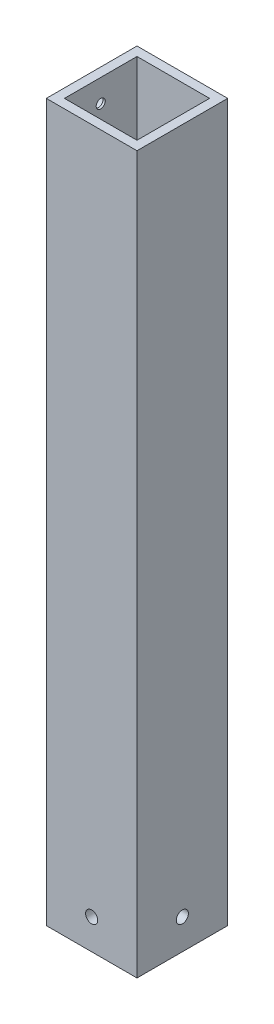
ISO-10303-21;
HEADER;
FILE_DESCRIPTION(('STEP AP214'),'2;1');
FILE_NAME('part.step','',(''),(''),'','','');
FILE_SCHEMA(('AUTOMOTIVE_DESIGN { 1 0 10303 214 1 1 1 1 }'));
ENDSEC;
DATA;
#1=APPLICATION_CONTEXT('core data for automotive mechanical design processes');
#2=APPLICATION_PROTOCOL_DEFINITION('international standard','automotive_design',2000,#1);
#3=PRODUCT_CONTEXT('',#1,'mechanical');
#4=PRODUCT('Part','Part','',(#3));
#5=PRODUCT_RELATED_PRODUCT_CATEGORY('part','',(#4));
#6=PRODUCT_DEFINITION_FORMATION('','',#4);
#7=PRODUCT_DEFINITION_CONTEXT('part definition',#1,'design');
#8=PRODUCT_DEFINITION('design','',#6,#7);
#9=PRODUCT_DEFINITION_SHAPE('','',#8);
#10=(LENGTH_UNIT() NAMED_UNIT(*) SI_UNIT(.MILLI.,.METRE.));
#11=(NAMED_UNIT(*) PLANE_ANGLE_UNIT() SI_UNIT($,.RADIAN.));
#12=(NAMED_UNIT(*) SI_UNIT($,.STERADIAN.) SOLID_ANGLE_UNIT());
#13=UNCERTAINTY_MEASURE_WITH_UNIT(LENGTH_MEASURE(1.E-05),#10,'distance_accuracy_value','');
#14=(GEOMETRIC_REPRESENTATION_CONTEXT(3) GLOBAL_UNCERTAINTY_ASSIGNED_CONTEXT((#13)) GLOBAL_UNIT_ASSIGNED_CONTEXT((#10,
#11,#12)) REPRESENTATION_CONTEXT('',''));
#15=CARTESIAN_POINT('',(0.,0.,0.));
#16=DIRECTION('',(0.,0.,1.));
#17=DIRECTION('',(1.,0.,0.));
#18=AXIS2_PLACEMENT_3D('',#15,#16,#17);
#19=CARTESIAN_POINT('',(4.99999999999998,204.5,0.));
#20=DIRECTION('',(-1.,0.,0.));
#21=DIRECTION('',(0.,0.,1.));
#22=AXIS2_PLACEMENT_3D('',#19,#20,#21);
#23=CYLINDRICAL_SURFACE('',#22,1.5);
#24=CARTESIAN_POINT('',(-12.,204.5,0.));
#25=DIRECTION('',(-1.,0.,0.));
#26=DIRECTION('',(0.,0.,1.));
#27=AXIS2_PLACEMENT_3D('',#24,#25,#26);
#28=CIRCLE('',#27,1.49999999999999);
#29=CARTESIAN_POINT('',(-12.,204.5,1.5));
#30=VERTEX_POINT('',#29);
#31=EDGE_CURVE('E143',#30,#30,#28,.T.);
#32=ORIENTED_EDGE('',*,*,#31,.F.);
#33=EDGE_LOOP('',(#32));
#34=FACE_BOUND('',#33,.T.);
#35=CARTESIAN_POINT('',(-12.75,204.5,0.));
#36=DIRECTION('',(-1.,0.,0.));
#37=DIRECTION('',(0.,0.,1.));
#38=AXIS2_PLACEMENT_3D('',#35,#36,#37);
#39=CIRCLE('',#38,1.5);
#40=CARTESIAN_POINT('',(-12.75,204.5,1.5));
#41=VERTEX_POINT('',#40);
#42=EDGE_CURVE('E146',#41,#41,#39,.F.);
#43=ORIENTED_EDGE('',*,*,#42,.F.);
#44=EDGE_LOOP('',(#43));
#45=FACE_BOUND('',#44,.T.);
#46=ADVANCED_FACE('F32',(#34,#45),#23,.F.);
#47=CARTESIAN_POINT('',(15.,230.,15.));
#48=DIRECTION('',(0.,0.,-1.));
#49=DIRECTION('',(-1.,0.,0.));
#50=AXIS2_PLACEMENT_3D('',#47,#48,#49);
#51=PLANE('',#50);
#52=CARTESIAN_POINT('',(0.,-15.,15.));
#53=DIRECTION('',(0.,0.,-1.));
#54=DIRECTION('',(-1.,0.,0.));
#55=AXIS2_PLACEMENT_3D('',#52,#53,#54);
#56=CIRCLE('',#55,2.);
#57=CARTESIAN_POINT('',(-2.,-15.,15.));
#58=VERTEX_POINT('',#57);
#59=EDGE_CURVE('E161',#58,#58,#56,.T.);
#60=ORIENTED_EDGE('',*,*,#59,.T.);
#61=EDGE_LOOP('',(#60));
#62=FACE_BOUND('',#61,.T.);
#63=DIRECTION('',(0.,-1.,0.));
#64=VECTOR('',#63,1.);
#65=CARTESIAN_POINT('',(-15.,230.,15.));
#66=LINE('',#65,#64);
#67=CARTESIAN_POINT('',(-15.,212.,15.));
#68=VERTEX_POINT('',#67);
#69=CARTESIAN_POINT('',(-15.,-25.,15.));
#70=VERTEX_POINT('',#69);
#71=EDGE_CURVE('E40',#68,#70,#66,.T.);
#72=ORIENTED_EDGE('',*,*,#71,.T.);
#73=DIRECTION('',(1.,0.,0.));
#74=VECTOR('',#73,1.);
#75=CARTESIAN_POINT('',(15.,-25.,15.));
#76=LINE('',#75,#74);
#77=CARTESIAN_POINT('',(15.,-25.,15.));
#78=VERTEX_POINT('',#77);
#79=EDGE_CURVE('E164',#70,#78,#76,.T.);
#80=ORIENTED_EDGE('',*,*,#79,.T.);
#81=DIRECTION('',(0.,-1.,0.));
#82=VECTOR('',#81,1.);
#83=CARTESIAN_POINT('',(15.,230.,15.));
#84=LINE('',#83,#82);
#85=CARTESIAN_POINT('',(15.,212.,15.));
#86=VERTEX_POINT('',#85);
#87=EDGE_CURVE('E138',#86,#78,#84,.T.);
#88=ORIENTED_EDGE('',*,*,#87,.F.);
#89=DIRECTION('',(1.,0.,0.));
#90=VECTOR('',#89,1.);
#91=CARTESIAN_POINT('',(15.,212.,15.));
#92=LINE('',#91,#90);
#93=EDGE_CURVE('E130',#68,#86,#92,.T.);
#94=ORIENTED_EDGE('',*,*,#93,.F.);
#95=EDGE_LOOP('',(#72,#80,#88,#94));
#96=FACE_BOUND('',#95,.T.);
#97=ADVANCED_FACE('F215',(#62,#96),#51,.F.);
#98=CARTESIAN_POINT('',(-15.,230.,15.));
#99=DIRECTION('',(1.,0.,0.));
#100=DIRECTION('',(0.,0.,-1.));
#101=AXIS2_PLACEMENT_3D('',#98,#99,#100);
#102=PLANE('',#101);
#103=CARTESIAN_POINT('',(-15.,-15.,0.));
#104=DIRECTION('',(-1.,0.,0.));
#105=DIRECTION('',(0.,0.,1.));
#106=AXIS2_PLACEMENT_3D('',#103,#104,#105);
#107=CIRCLE('',#106,2.);
#108=CARTESIAN_POINT('',(-15.,-15.,2.));
#109=VERTEX_POINT('',#108);
#110=EDGE_CURVE('E153',#109,#109,#107,.T.);
#111=ORIENTED_EDGE('',*,*,#110,.F.);
#112=EDGE_LOOP('',(#111));
#113=FACE_BOUND('',#112,.T.);
#114=CARTESIAN_POINT('',(-15.,204.5,0.));
#115=DIRECTION('',(-1.,0.,0.));
#116=DIRECTION('',(0.,0.,1.));
#117=AXIS2_PLACEMENT_3D('',#114,#115,#116);
#118=CIRCLE('',#117,2.5);
#119=CARTESIAN_POINT('',(-15.,204.5,2.5));
#120=VERTEX_POINT('',#119);
#121=EDGE_CURVE('E181',#120,#120,#118,.T.);
#122=ORIENTED_EDGE('',*,*,#121,.F.);
#123=EDGE_LOOP('',(#122));
#124=FACE_BOUND('',#123,.T.);
#125=DIRECTION('',(0.,-1.,0.));
#126=VECTOR('',#125,1.);
#127=CARTESIAN_POINT('',(-15.,230.,-15.));
#128=LINE('',#127,#126);
#129=CARTESIAN_POINT('',(-15.,212.,-15.));
#130=VERTEX_POINT('',#129);
#131=CARTESIAN_POINT('',(-15.,-25.,-15.));
#132=VERTEX_POINT('',#131);
#133=EDGE_CURVE('E132',#130,#132,#128,.T.);
#134=ORIENTED_EDGE('',*,*,#133,.T.);
#135=DIRECTION('',(0.,0.,1.));
#136=VECTOR('',#135,1.);
#137=CARTESIAN_POINT('',(-15.,-25.,15.));
#138=LINE('',#137,#136);
#139=EDGE_CURVE('E47',#132,#70,#138,.T.);
#140=ORIENTED_EDGE('',*,*,#139,.T.);
#141=ORIENTED_EDGE('',*,*,#71,.F.);
#142=DIRECTION('',(0.,0.,1.));
#143=VECTOR('',#142,1.);
#144=CARTESIAN_POINT('',(-15.,212.,15.));
#145=LINE('',#144,#143);
#146=EDGE_CURVE('E128',#130,#68,#145,.T.);
#147=ORIENTED_EDGE('',*,*,#146,.F.);
#148=EDGE_LOOP('',(#134,#140,#141,#147));
#149=FACE_BOUND('',#148,.T.);
#150=ADVANCED_FACE('F34',(#113,#124,#149),#102,.F.);
#151=CARTESIAN_POINT('',(15.,230.,15.));
#152=DIRECTION('',(-1.,0.,0.));
#153=DIRECTION('',(0.,0.,1.));
#154=AXIS2_PLACEMENT_3D('',#151,#152,#153);
#155=PLANE('',#154);
#156=CARTESIAN_POINT('',(15.,-15.,0.));
#157=DIRECTION('',(-1.,0.,0.));
#158=DIRECTION('',(0.,0.,1.));
#159=AXIS2_PLACEMENT_3D('',#156,#157,#158);
#160=CIRCLE('',#159,2.);
#161=CARTESIAN_POINT('',(15.,-15.,2.));
#162=VERTEX_POINT('',#161);
#163=EDGE_CURVE('E178',#162,#162,#160,.T.);
#164=ORIENTED_EDGE('',*,*,#163,.T.);
#165=EDGE_LOOP('',(#164));
#166=FACE_BOUND('',#165,.T.);
#167=ORIENTED_EDGE('',*,*,#87,.T.);
#168=DIRECTION('',(0.,0.,-1.));
#169=VECTOR('',#168,1.);
#170=CARTESIAN_POINT('',(15.,-25.,15.));
#171=LINE('',#170,#169);
#172=CARTESIAN_POINT('',(15.,-25.,-15.));
#173=VERTEX_POINT('',#172);
#174=EDGE_CURVE('E430',#78,#173,#171,.T.);
#175=ORIENTED_EDGE('',*,*,#174,.T.);
#176=DIRECTION('',(0.,-1.,0.));
#177=VECTOR('',#176,1.);
#178=CARTESIAN_POINT('',(15.,230.,-15.));
#179=LINE('',#178,#177);
#180=CARTESIAN_POINT('',(15.,212.,-15.));
#181=VERTEX_POINT('',#180);
#182=EDGE_CURVE('E135',#181,#173,#179,.T.);
#183=ORIENTED_EDGE('',*,*,#182,.F.);
#184=DIRECTION('',(0.,0.,-1.));
#185=VECTOR('',#184,1.);
#186=CARTESIAN_POINT('',(15.,212.,15.));
#187=LINE('',#186,#185);
#188=EDGE_CURVE('E125',#86,#181,#187,.T.);
#189=ORIENTED_EDGE('',*,*,#188,.F.);
#190=EDGE_LOOP('',(#167,#175,#183,#189));
#191=FACE_BOUND('',#190,.T.);
#192=ADVANCED_FACE('F210',(#166,#191),#155,.F.);
#193=CARTESIAN_POINT('',(15.,230.,-15.));
#194=DIRECTION('',(0.,0.,1.));
#195=DIRECTION('',(1.,0.,0.));
#196=AXIS2_PLACEMENT_3D('',#193,#194,#195);
#197=PLANE('',#196);
#198=CARTESIAN_POINT('',(0.,-15.,-15.));
#199=DIRECTION('',(0.,0.,-1.));
#200=DIRECTION('',(-1.,0.,0.));
#201=AXIS2_PLACEMENT_3D('',#198,#199,#200);
#202=CIRCLE('',#201,2.);
#203=CARTESIAN_POINT('',(-2.,-15.,-15.));
#204=VERTEX_POINT('',#203);
#205=EDGE_CURVE('E157',#204,#204,#202,.T.);
#206=ORIENTED_EDGE('',*,*,#205,.F.);
#207=EDGE_LOOP('',(#206));
#208=FACE_BOUND('',#207,.T.);
#209=ORIENTED_EDGE('',*,*,#182,.T.);
#210=DIRECTION('',(-1.,0.,0.));
#211=VECTOR('',#210,1.);
#212=CARTESIAN_POINT('',(15.,-25.,-15.));
#213=LINE('',#212,#211);
#214=EDGE_CURVE('E107',#173,#132,#213,.T.);
#215=ORIENTED_EDGE('',*,*,#214,.T.);
#216=ORIENTED_EDGE('',*,*,#133,.F.);
#217=DIRECTION('',(-1.,0.,0.));
#218=VECTOR('',#217,1.);
#219=CARTESIAN_POINT('',(15.,212.,-15.));
#220=LINE('',#219,#218);
#221=EDGE_CURVE('E123',#181,#130,#220,.T.);
#222=ORIENTED_EDGE('',*,*,#221,.F.);
#223=EDGE_LOOP('',(#209,#215,#216,#222));
#224=FACE_BOUND('',#223,.T.);
#225=ADVANCED_FACE('F201',(#208,#224),#197,.F.);
#226=CARTESIAN_POINT('',(0.,212.,0.));
#227=DIRECTION('',(0.,1.,0.));
#228=DIRECTION('',(0.,0.,1.));
#229=AXIS2_PLACEMENT_3D('',#226,#227,#228);
#230=PLANE('',#229);
#231=ORIENTED_EDGE('',*,*,#93,.T.);
#232=ORIENTED_EDGE('',*,*,#188,.T.);
#233=ORIENTED_EDGE('',*,*,#221,.T.);
#234=ORIENTED_EDGE('',*,*,#146,.T.);
#235=EDGE_LOOP('',(#231,#232,#233,#234));
#236=FACE_BOUND('',#235,.T.);
#237=DIRECTION('',(0.,0.,1.));
#238=VECTOR('',#237,1.);
#239=CARTESIAN_POINT('',(-12.,212.,-12.));
#240=LINE('',#239,#238);
#241=CARTESIAN_POINT('',(-12.,212.,-12.));
#242=VERTEX_POINT('',#241);
#243=CARTESIAN_POINT('',(-12.,212.,12.));
#244=VERTEX_POINT('',#243);
#245=EDGE_CURVE('E112',#242,#244,#240,.T.);
#246=ORIENTED_EDGE('',*,*,#245,.F.);
#247=DIRECTION('',(-1.,0.,0.));
#248=VECTOR('',#247,1.);
#249=CARTESIAN_POINT('',(12.,212.,-12.));
#250=LINE('',#249,#248);
#251=CARTESIAN_POINT('',(12.,212.,-12.));
#252=VERTEX_POINT('',#251);
#253=EDGE_CURVE('E114',#252,#242,#250,.T.);
#254=ORIENTED_EDGE('',*,*,#253,.F.);
#255=DIRECTION('',(0.,0.,-1.));
#256=VECTOR('',#255,1.);
#257=CARTESIAN_POINT('',(12.,212.,-12.));
#258=LINE('',#257,#256);
#259=CARTESIAN_POINT('',(12.,212.,12.));
#260=VERTEX_POINT('',#259);
#261=EDGE_CURVE('E119',#260,#252,#258,.T.);
#262=ORIENTED_EDGE('',*,*,#261,.F.);
#263=DIRECTION('',(1.,0.,0.));
#264=VECTOR('',#263,1.);
#265=CARTESIAN_POINT('',(12.,212.,12.));
#266=LINE('',#265,#264);
#267=EDGE_CURVE('E187',#244,#260,#266,.T.);
#268=ORIENTED_EDGE('',*,*,#267,.F.);
#269=EDGE_LOOP('',(#246,#254,#262,#268));
#270=FACE_BOUND('',#269,.T.);
#271=ADVANCED_FACE('F199',(#236,#270),#230,.T.);
#272=CARTESIAN_POINT('',(12.,0.,12.));
#273=DIRECTION('',(0.,0.,1.));
#274=DIRECTION('',(1.,0.,0.));
#275=AXIS2_PLACEMENT_3D('',#272,#273,#274);
#276=PLANE('',#275);
#277=CARTESIAN_POINT('',(0.,-15.,12.));
#278=DIRECTION('',(0.,0.,1.));
#279=DIRECTION('',(1.,0.,0.));
#280=AXIS2_PLACEMENT_3D('',#277,#278,#279);
#281=CIRCLE('',#280,2.);
#282=CARTESIAN_POINT('',(2.,-15.,12.));
#283=VERTEX_POINT('',#282);
#284=EDGE_CURVE('E156',#283,#283,#281,.T.);
#285=ORIENTED_EDGE('',*,*,#284,.T.);
#286=EDGE_LOOP('',(#285));
#287=FACE_BOUND('',#286,.T.);
#288=DIRECTION('',(0.,1.,0.));
#289=VECTOR('',#288,1.);
#290=CARTESIAN_POINT('',(12.,0.,12.));
#291=LINE('',#290,#289);
#292=CARTESIAN_POINT('',(12.,-25.,12.));
#293=VERTEX_POINT('',#292);
#294=EDGE_CURVE('E106',#293,#260,#291,.T.);
#295=ORIENTED_EDGE('',*,*,#294,.F.);
#296=DIRECTION('',(-1.,0.,0.));
#297=VECTOR('',#296,1.);
#298=CARTESIAN_POINT('',(12.,-25.,12.));
#299=LINE('',#298,#297);
#300=CARTESIAN_POINT('',(-12.,-25.,12.));
#301=VERTEX_POINT('',#300);
#302=EDGE_CURVE('E95',#293,#301,#299,.T.);
#303=ORIENTED_EDGE('',*,*,#302,.T.);
#304=DIRECTION('',(0.,1.,0.));
#305=VECTOR('',#304,1.);
#306=CARTESIAN_POINT('',(-12.,0.,12.));
#307=LINE('',#306,#305);
#308=EDGE_CURVE('E104',#301,#244,#307,.T.);
#309=ORIENTED_EDGE('',*,*,#308,.T.);
#310=ORIENTED_EDGE('',*,*,#267,.T.);
#311=EDGE_LOOP('',(#295,#303,#309,#310));
#312=FACE_BOUND('',#311,.T.);
#313=ADVANCED_FACE('F102',(#287,#312),#276,.F.);
#314=CARTESIAN_POINT('',(12.,0.,-12.));
#315=DIRECTION('',(1.,0.,0.));
#316=DIRECTION('',(0.,0.,-1.));
#317=AXIS2_PLACEMENT_3D('',#314,#315,#316);
#318=PLANE('',#317);
#319=CARTESIAN_POINT('',(12.,-15.,0.));
#320=DIRECTION('',(1.,0.,0.));
#321=DIRECTION('',(0.,0.,-1.));
#322=AXIS2_PLACEMENT_3D('',#319,#320,#321);
#323=CIRCLE('',#322,2.);
#324=CARTESIAN_POINT('',(12.,-15.,-2.));
#325=VERTEX_POINT('',#324);
#326=EDGE_CURVE('E152',#325,#325,#323,.T.);
#327=ORIENTED_EDGE('',*,*,#326,.T.);
#328=EDGE_LOOP('',(#327));
#329=FACE_BOUND('',#328,.T.);
#330=DIRECTION('',(0.,1.,0.));
#331=VECTOR('',#330,1.);
#332=CARTESIAN_POINT('',(12.,0.,-12.));
#333=LINE('',#332,#331);
#334=CARTESIAN_POINT('',(12.,-25.,-12.));
#335=VERTEX_POINT('',#334);
#336=EDGE_CURVE('E116',#335,#252,#333,.T.);
#337=ORIENTED_EDGE('',*,*,#336,.F.);
#338=DIRECTION('',(0.,0.,1.));
#339=VECTOR('',#338,1.);
#340=CARTESIAN_POINT('',(12.,-25.,-12.));
#341=LINE('',#340,#339);
#342=EDGE_CURVE('E108',#335,#293,#341,.T.);
#343=ORIENTED_EDGE('',*,*,#342,.T.);
#344=ORIENTED_EDGE('',*,*,#294,.T.);
#345=ORIENTED_EDGE('',*,*,#261,.T.);
#346=EDGE_LOOP('',(#337,#343,#344,#345));
#347=FACE_BOUND('',#346,.T.);
#348=ADVANCED_FACE('F197',(#329,#347),#318,.F.);
#349=CARTESIAN_POINT('',(12.,0.,-12.));
#350=DIRECTION('',(0.,0.,-1.));
#351=DIRECTION('',(-1.,0.,0.));
#352=AXIS2_PLACEMENT_3D('',#349,#350,#351);
#353=PLANE('',#352);
#354=CARTESIAN_POINT('',(0.,-15.,-12.));
#355=DIRECTION('',(0.,0.,-1.));
#356=DIRECTION('',(-1.,0.,0.));
#357=AXIS2_PLACEMENT_3D('',#354,#355,#356);
#358=CIRCLE('',#357,2.);
#359=CARTESIAN_POINT('',(-2.,-15.,-12.));
#360=VERTEX_POINT('',#359);
#361=EDGE_CURVE('E154',#360,#360,#358,.T.);
#362=ORIENTED_EDGE('',*,*,#361,.T.);
#363=EDGE_LOOP('',(#362));
#364=FACE_BOUND('',#363,.T.);
#365=DIRECTION('',(0.,1.,0.));
#366=VECTOR('',#365,1.);
#367=CARTESIAN_POINT('',(-12.,0.,-12.));
#368=LINE('',#367,#366);
#369=CARTESIAN_POINT('',(-12.,-25.,-12.));
#370=VERTEX_POINT('',#369);
#371=EDGE_CURVE('E126',#370,#242,#368,.T.);
#372=ORIENTED_EDGE('',*,*,#371,.F.);
#373=DIRECTION('',(1.,0.,0.));
#374=VECTOR('',#373,1.);
#375=CARTESIAN_POINT('',(12.,-25.,-12.));
#376=LINE('',#375,#374);
#377=EDGE_CURVE('E55',#370,#335,#376,.T.);
#378=ORIENTED_EDGE('',*,*,#377,.T.);
#379=ORIENTED_EDGE('',*,*,#336,.T.);
#380=ORIENTED_EDGE('',*,*,#253,.T.);
#381=EDGE_LOOP('',(#372,#378,#379,#380));
#382=FACE_BOUND('',#381,.T.);
#383=ADVANCED_FACE('F193',(#364,#382),#353,.F.);
#384=CARTESIAN_POINT('',(-12.,0.,-12.));
#385=DIRECTION('',(-1.,0.,0.));
#386=DIRECTION('',(0.,0.,1.));
#387=AXIS2_PLACEMENT_3D('',#384,#385,#386);
#388=PLANE('',#387);
#389=CARTESIAN_POINT('',(-12.,-15.,0.));
#390=DIRECTION('',(-1.,0.,0.));
#391=DIRECTION('',(0.,0.,1.));
#392=AXIS2_PLACEMENT_3D('',#389,#390,#391);
#393=CIRCLE('',#392,2.);
#394=CARTESIAN_POINT('',(-12.,-15.,2.));
#395=VERTEX_POINT('',#394);
#396=EDGE_CURVE('E150',#395,#395,#393,.T.);
#397=ORIENTED_EDGE('',*,*,#396,.T.);
#398=EDGE_LOOP('',(#397));
#399=FACE_BOUND('',#398,.T.);
#400=ORIENTED_EDGE('',*,*,#31,.T.);
#401=EDGE_LOOP('',(#400));
#402=FACE_BOUND('',#401,.T.);
#403=ORIENTED_EDGE('',*,*,#308,.F.);
#404=DIRECTION('',(0.,0.,-1.));
#405=VECTOR('',#404,1.);
#406=CARTESIAN_POINT('',(-12.,-25.,-12.));
#407=LINE('',#406,#405);
#408=EDGE_CURVE('E11',#301,#370,#407,.T.);
#409=ORIENTED_EDGE('',*,*,#408,.T.);
#410=ORIENTED_EDGE('',*,*,#371,.T.);
#411=ORIENTED_EDGE('',*,*,#245,.T.);
#412=EDGE_LOOP('',(#403,#409,#410,#411));
#413=FACE_BOUND('',#412,.T.);
#414=ADVANCED_FACE('F110',(#399,#402,#413),#388,.F.);
#415=CARTESIAN_POINT('',(-12.75,204.5,0.));
#416=DIRECTION('',(-1.,0.,0.));
#417=DIRECTION('',(0.,0.,1.));
#418=AXIS2_PLACEMENT_3D('',#415,#416,#417);
#419=PLANE('',#418);
#420=CARTESIAN_POINT('',(-12.75,204.5,0.));
#421=DIRECTION('',(-1.,0.,0.));
#422=DIRECTION('',(0.,0.,1.));
#423=AXIS2_PLACEMENT_3D('',#420,#421,#422);
#424=CIRCLE('',#423,2.5);
#425=CARTESIAN_POINT('',(-12.75,204.5,2.5));
#426=VERTEX_POINT('',#425);
#427=EDGE_CURVE('E149',#426,#426,#424,.T.);
#428=ORIENTED_EDGE('',*,*,#427,.T.);
#429=EDGE_LOOP('',(#428));
#430=FACE_BOUND('',#429,.T.);
#431=ORIENTED_EDGE('',*,*,#42,.T.);
#432=EDGE_LOOP('',(#431));
#433=FACE_BOUND('',#432,.T.);
#434=ADVANCED_FACE('F225',(#430,#433),#419,.T.);
#435=CARTESIAN_POINT('',(-12.75,204.5,0.));
#436=DIRECTION('',(-1.,0.,0.));
#437=DIRECTION('',(0.,0.,1.));
#438=AXIS2_PLACEMENT_3D('',#435,#436,#437);
#439=CYLINDRICAL_SURFACE('',#438,2.5);
#440=ORIENTED_EDGE('',*,*,#427,.F.);
#441=EDGE_LOOP('',(#440));
#442=FACE_BOUND('',#441,.T.);
#443=ORIENTED_EDGE('',*,*,#121,.T.);
#444=EDGE_LOOP('',(#443));
#445=FACE_BOUND('',#444,.T.);
#446=ADVANCED_FACE('F233',(#442,#445),#439,.F.);
#447=CARTESIAN_POINT('',(37.,-15.,0.));
#448=DIRECTION('',(-1.,0.,0.));
#449=DIRECTION('',(0.,0.,1.));
#450=AXIS2_PLACEMENT_3D('',#447,#448,#449);
#451=CYLINDRICAL_SURFACE('',#450,2.);
#452=ORIENTED_EDGE('',*,*,#110,.T.);
#453=EDGE_LOOP('',(#452));
#454=FACE_BOUND('',#453,.T.);
#455=ORIENTED_EDGE('',*,*,#396,.F.);
#456=EDGE_LOOP('',(#455));
#457=FACE_BOUND('',#456,.T.);
#458=ADVANCED_FACE('F236',(#454,#457),#451,.F.);
#459=ORIENTED_EDGE('',*,*,#326,.F.);
#460=EDGE_LOOP('',(#459));
#461=FACE_BOUND('',#460,.T.);
#462=ORIENTED_EDGE('',*,*,#163,.F.);
#463=EDGE_LOOP('',(#462));
#464=FACE_BOUND('',#463,.T.);
#465=ADVANCED_FACE('F241',(#461,#464),#451,.F.);
#466=CARTESIAN_POINT('',(0.,-15.,37.));
#467=DIRECTION('',(0.,0.,-1.));
#468=DIRECTION('',(-1.,0.,0.));
#469=AXIS2_PLACEMENT_3D('',#466,#467,#468);
#470=CYLINDRICAL_SURFACE('',#469,2.);
#471=ORIENTED_EDGE('',*,*,#205,.T.);
#472=EDGE_LOOP('',(#471));
#473=FACE_BOUND('',#472,.T.);
#474=ORIENTED_EDGE('',*,*,#361,.F.);
#475=EDGE_LOOP('',(#474));
#476=FACE_BOUND('',#475,.T.);
#477=ADVANCED_FACE('F244',(#473,#476),#470,.F.);
#478=ORIENTED_EDGE('',*,*,#284,.F.);
#479=EDGE_LOOP('',(#478));
#480=FACE_BOUND('',#479,.T.);
#481=ORIENTED_EDGE('',*,*,#59,.F.);
#482=EDGE_LOOP('',(#481));
#483=FACE_BOUND('',#482,.T.);
#484=ADVANCED_FACE('F246',(#480,#483),#470,.F.);
#485=CARTESIAN_POINT('',(0.,-25.,0.));
#486=DIRECTION('',(0.,1.,0.));
#487=DIRECTION('',(0.,0.,1.));
#488=AXIS2_PLACEMENT_3D('',#485,#486,#487);
#489=PLANE('',#488);
#490=ORIENTED_EDGE('',*,*,#342,.F.);
#491=ORIENTED_EDGE('',*,*,#377,.F.);
#492=ORIENTED_EDGE('',*,*,#408,.F.);
#493=ORIENTED_EDGE('',*,*,#302,.F.);
#494=EDGE_LOOP('',(#490,#491,#492,#493));
#495=FACE_BOUND('',#494,.T.);
#496=ORIENTED_EDGE('',*,*,#139,.F.);
#497=ORIENTED_EDGE('',*,*,#214,.F.);
#498=ORIENTED_EDGE('',*,*,#174,.F.);
#499=ORIENTED_EDGE('',*,*,#79,.F.);
#500=EDGE_LOOP('',(#496,#497,#498,#499));
#501=FACE_BOUND('',#500,.T.);
#502=ADVANCED_FACE('F94',(#495,#501),#489,.F.);
#503=CLOSED_SHELL('',(#46,#97,#150,#192,#225,#271,#313,#348,#383,#414,#434,#446,#458,#465,#477,
#484,#502));
#504=MANIFOLD_SOLID_BREP('B2',#503);
#505=ADVANCED_BREP_SHAPE_REPRESENTATION('',(#18,#504),#14);
#506=SHAPE_DEFINITION_REPRESENTATION(#9,#505);
ENDSEC;
END-ISO-10303-21;
